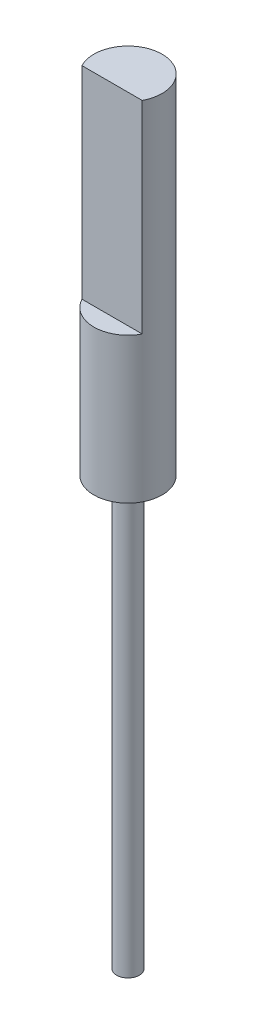
ISO-10303-21;
HEADER;
FILE_DESCRIPTION(('STEP AP214'),'2;1');
FILE_NAME('part.step','',(''),(''),'','','');
FILE_SCHEMA(('AUTOMOTIVE_DESIGN { 1 0 10303 214 1 1 1 1 }'));
ENDSEC;
DATA;
#1=APPLICATION_CONTEXT('core data for automotive mechanical design processes');
#2=APPLICATION_PROTOCOL_DEFINITION('international standard','automotive_design',2000,#1);
#3=PRODUCT_CONTEXT('',#1,'mechanical');
#4=PRODUCT('Part','Part','',(#3));
#5=PRODUCT_RELATED_PRODUCT_CATEGORY('part','',(#4));
#6=PRODUCT_DEFINITION_FORMATION('','',#4);
#7=PRODUCT_DEFINITION_CONTEXT('part definition',#1,'design');
#8=PRODUCT_DEFINITION('design','',#6,#7);
#9=PRODUCT_DEFINITION_SHAPE('','',#8);
#10=(LENGTH_UNIT() NAMED_UNIT(*) SI_UNIT(.MILLI.,.METRE.));
#11=(NAMED_UNIT(*) PLANE_ANGLE_UNIT() SI_UNIT($,.RADIAN.));
#12=(NAMED_UNIT(*) SI_UNIT($,.STERADIAN.) SOLID_ANGLE_UNIT());
#13=UNCERTAINTY_MEASURE_WITH_UNIT(LENGTH_MEASURE(1.E-05),#10,'distance_accuracy_value','');
#14=(GEOMETRIC_REPRESENTATION_CONTEXT(3) GLOBAL_UNCERTAINTY_ASSIGNED_CONTEXT((#13)) GLOBAL_UNIT_ASSIGNED_CONTEXT((#10,
#11,#12)) REPRESENTATION_CONTEXT('',''));
#15=CARTESIAN_POINT('',(0.,0.,0.));
#16=DIRECTION('',(0.,0.,1.));
#17=DIRECTION('',(1.,0.,0.));
#18=AXIS2_PLACEMENT_3D('',#15,#16,#17);
#19=CARTESIAN_POINT('',(0.,18.8,0.));
#20=DIRECTION('',(0.,-1.,0.));
#21=DIRECTION('',(0.,0.,-1.));
#22=AXIS2_PLACEMENT_3D('',#19,#20,#21);
#23=CYLINDRICAL_SURFACE('',#22,0.5);
#24=CARTESIAN_POINT('',(0.,18.8,0.));
#25=DIRECTION('',(0.,1.,0.));
#26=DIRECTION('',(0.,0.,1.));
#27=AXIS2_PLACEMENT_3D('',#24,#25,#26);
#28=CIRCLE('',#27,0.5);
#29=CARTESIAN_POINT('',(0.,18.8,0.5));
#30=VERTEX_POINT('',#29);
#31=EDGE_CURVE('E11',#30,#30,#28,.T.);
#32=ORIENTED_EDGE('',*,*,#31,.F.);
#33=EDGE_LOOP('',(#32));
#34=FACE_BOUND('',#33,.T.);
#35=CARTESIAN_POINT('',(0.,0.,0.));
#36=DIRECTION('',(0.,1.,0.));
#37=DIRECTION('',(0.,0.,1.));
#38=AXIS2_PLACEMENT_3D('',#35,#36,#37);
#39=CIRCLE('',#38,0.5);
#40=CARTESIAN_POINT('',(0.,0.,0.5));
#41=VERTEX_POINT('',#40);
#42=EDGE_CURVE('E46',#41,#41,#39,.T.);
#43=ORIENTED_EDGE('',*,*,#42,.T.);
#44=EDGE_LOOP('',(#43));
#45=FACE_BOUND('',#44,.T.);
#46=ADVANCED_FACE('F43',(#34,#45),#23,.T.);
#47=CARTESIAN_POINT('',(0.,0.,0.));
#48=DIRECTION('',(0.,1.,0.));
#49=DIRECTION('',(0.,0.,1.));
#50=AXIS2_PLACEMENT_3D('',#47,#48,#49);
#51=PLANE('',#50);
#52=ORIENTED_EDGE('',*,*,#42,.F.);
#53=EDGE_LOOP('',(#52));
#54=FACE_BOUND('',#53,.T.);
#55=ADVANCED_FACE('F101',(#54),#51,.F.);
#56=CARTESIAN_POINT('',(0.,34.1,0.));
#57=DIRECTION('',(0.,-1.,0.));
#58=DIRECTION('',(0.,0.,-1.));
#59=AXIS2_PLACEMENT_3D('',#56,#57,#58);
#60=CYLINDRICAL_SURFACE('',#59,1.5);
#61=CARTESIAN_POINT('',(0.,34.1,0.));
#62=DIRECTION('',(0.,1.,0.));
#63=DIRECTION('',(0.,0.,1.));
#64=AXIS2_PLACEMENT_3D('',#61,#62,#63);
#65=CIRCLE('',#64,1.5);
#66=CARTESIAN_POINT('',(1.32664991614216,34.1,0.7));
#67=VERTEX_POINT('',#66);
#68=CARTESIAN_POINT('',(-1.32664991614216,34.1,0.7));
#69=VERTEX_POINT('',#68);
#70=EDGE_CURVE('E79',#67,#69,#65,.T.);
#71=ORIENTED_EDGE('',*,*,#70,.F.);
#72=DIRECTION('',(0.,1.,0.));
#73=VECTOR('',#72,1.);
#74=CARTESIAN_POINT('',(1.32664991614216,25.2,0.7));
#75=LINE('',#74,#73);
#76=CARTESIAN_POINT('',(1.32664991614216,25.2,0.7));
#77=VERTEX_POINT('',#76);
#78=EDGE_CURVE('E57',#77,#67,#75,.T.);
#79=ORIENTED_EDGE('',*,*,#78,.F.);
#80=CARTESIAN_POINT('',(0.,25.2,0.));
#81=DIRECTION('',(0.,1.,0.));
#82=DIRECTION('',(0.,0.,1.));
#83=AXIS2_PLACEMENT_3D('',#80,#81,#82);
#84=CIRCLE('',#83,1.5);
#85=CARTESIAN_POINT('',(-1.32664991614216,25.2,0.7));
#86=VERTEX_POINT('',#85);
#87=EDGE_CURVE('E73',#86,#77,#84,.T.);
#88=ORIENTED_EDGE('',*,*,#87,.F.);
#89=DIRECTION('',(0.,1.,0.));
#90=VECTOR('',#89,1.);
#91=CARTESIAN_POINT('',(-1.32664991614216,25.2,0.7));
#92=LINE('',#91,#90);
#93=EDGE_CURVE('E63',#86,#69,#92,.T.);
#94=ORIENTED_EDGE('',*,*,#93,.T.);
#95=EDGE_LOOP('',(#71,#79,#88,#94));
#96=FACE_BOUND('',#95,.T.);
#97=CARTESIAN_POINT('',(0.,18.8,0.));
#98=DIRECTION('',(0.,1.,0.));
#99=DIRECTION('',(0.,0.,1.));
#100=AXIS2_PLACEMENT_3D('',#97,#98,#99);
#101=CIRCLE('',#100,1.5);
#102=CARTESIAN_POINT('',(0.,18.8,1.5));
#103=VERTEX_POINT('',#102);
#104=EDGE_CURVE('E80',#103,#103,#101,.T.);
#105=ORIENTED_EDGE('',*,*,#104,.T.);
#106=EDGE_LOOP('',(#105));
#107=FACE_BOUND('',#106,.T.);
#108=ADVANCED_FACE('F77',(#96,#107),#60,.T.);
#109=CARTESIAN_POINT('',(0.,34.1,0.));
#110=DIRECTION('',(0.,1.,0.));
#111=DIRECTION('',(0.,0.,1.));
#112=AXIS2_PLACEMENT_3D('',#109,#110,#111);
#113=PLANE('',#112);
#114=DIRECTION('',(-1.,0.,0.));
#115=VECTOR('',#114,1.);
#116=CARTESIAN_POINT('',(-1.32664991614216,34.1,0.7));
#117=LINE('',#116,#115);
#118=EDGE_CURVE('E68',#67,#69,#117,.T.);
#119=ORIENTED_EDGE('',*,*,#118,.F.);
#120=ORIENTED_EDGE('',*,*,#70,.T.);
#121=EDGE_LOOP('',(#119,#120));
#122=FACE_BOUND('',#121,.T.);
#123=ADVANCED_FACE('F82',(#122),#113,.T.);
#124=CARTESIAN_POINT('',(0.,18.8,0.));
#125=DIRECTION('',(0.,1.,0.));
#126=DIRECTION('',(0.,0.,1.));
#127=AXIS2_PLACEMENT_3D('',#124,#125,#126);
#128=PLANE('',#127);
#129=ORIENTED_EDGE('',*,*,#31,.T.);
#130=EDGE_LOOP('',(#129));
#131=FACE_BOUND('',#130,.T.);
#132=ORIENTED_EDGE('',*,*,#104,.F.);
#133=EDGE_LOOP('',(#132));
#134=FACE_BOUND('',#133,.T.);
#135=ADVANCED_FACE('F98',(#131,#134),#128,.F.);
#136=CARTESIAN_POINT('',(-1.32664991614216,25.2,0.7));
#137=DIRECTION('',(0.,0.,-1.));
#138=DIRECTION('',(-1.,0.,0.));
#139=AXIS2_PLACEMENT_3D('',#136,#137,#138);
#140=PLANE('',#139);
#141=ORIENTED_EDGE('',*,*,#118,.T.);
#142=ORIENTED_EDGE('',*,*,#93,.F.);
#143=DIRECTION('',(-1.,0.,0.));
#144=VECTOR('',#143,1.);
#145=CARTESIAN_POINT('',(-1.32664991614216,25.2,0.7));
#146=LINE('',#145,#144);
#147=EDGE_CURVE('E88',#77,#86,#146,.T.);
#148=ORIENTED_EDGE('',*,*,#147,.F.);
#149=ORIENTED_EDGE('',*,*,#78,.T.);
#150=EDGE_LOOP('',(#141,#142,#148,#149));
#151=FACE_BOUND('',#150,.T.);
#152=ADVANCED_FACE('F69',(#151),#140,.F.);
#153=CARTESIAN_POINT('',(0.,25.2,0.));
#154=DIRECTION('',(0.,1.,0.));
#155=DIRECTION('',(0.,0.,1.));
#156=AXIS2_PLACEMENT_3D('',#153,#154,#155);
#157=PLANE('',#156);
#158=ORIENTED_EDGE('',*,*,#87,.T.);
#159=ORIENTED_EDGE('',*,*,#147,.T.);
#160=EDGE_LOOP('',(#158,#159));
#161=FACE_BOUND('',#160,.T.);
#162=ADVANCED_FACE('F92',(#161),#157,.T.);
#163=CLOSED_SHELL('',(#46,#55,#108,#123,#135,#152,#162));
#164=MANIFOLD_SOLID_BREP('B2',#163);
#165=ADVANCED_BREP_SHAPE_REPRESENTATION('',(#18,#164),#14);
#166=SHAPE_DEFINITION_REPRESENTATION(#9,#165);
ENDSEC;
END-ISO-10303-21;
